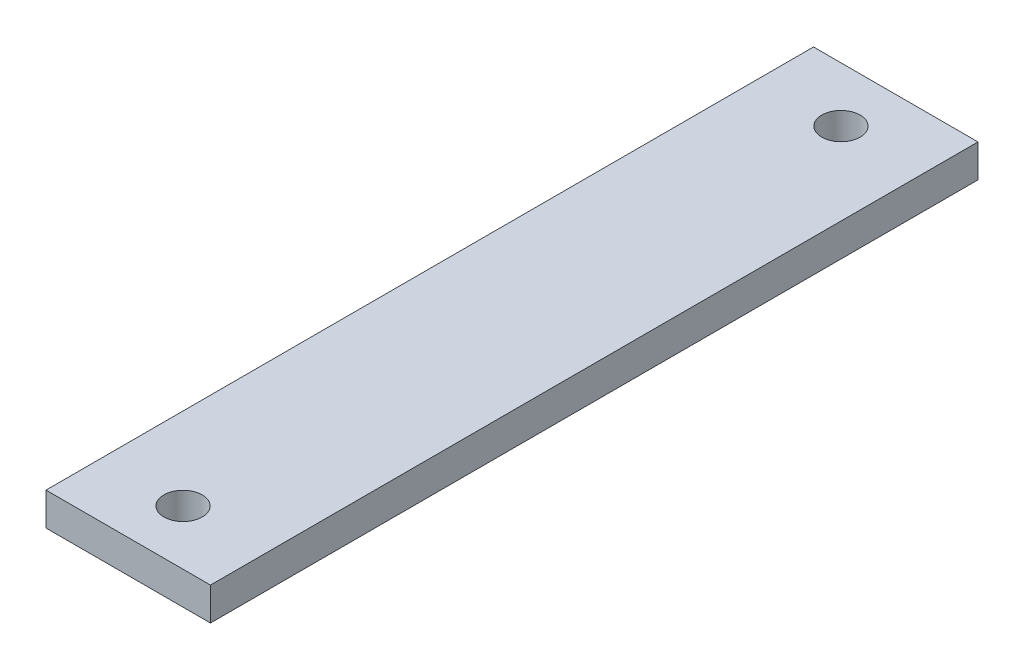
ISO-10303-21;
HEADER;
FILE_DESCRIPTION(('STEP AP214'),'2;1');
FILE_NAME('part.step','',(''),(''),'','','');
FILE_SCHEMA(('AUTOMOTIVE_DESIGN { 1 0 10303 214 1 1 1 1 }'));
ENDSEC;
DATA;
#1=APPLICATION_CONTEXT('core data for automotive mechanical design processes');
#2=APPLICATION_PROTOCOL_DEFINITION('international standard','automotive_design',2000,#1);
#3=PRODUCT_CONTEXT('',#1,'mechanical');
#4=PRODUCT('Part','Part','',(#3));
#5=PRODUCT_RELATED_PRODUCT_CATEGORY('part','',(#4));
#6=PRODUCT_DEFINITION_FORMATION('','',#4);
#7=PRODUCT_DEFINITION_CONTEXT('part definition',#1,'design');
#8=PRODUCT_DEFINITION('design','',#6,#7);
#9=PRODUCT_DEFINITION_SHAPE('','',#8);
#10=(LENGTH_UNIT() NAMED_UNIT(*) SI_UNIT(.MILLI.,.METRE.));
#11=(NAMED_UNIT(*) PLANE_ANGLE_UNIT() SI_UNIT($,.RADIAN.));
#12=(NAMED_UNIT(*) SI_UNIT($,.STERADIAN.) SOLID_ANGLE_UNIT());
#13=UNCERTAINTY_MEASURE_WITH_UNIT(LENGTH_MEASURE(1.E-05),#10,'distance_accuracy_value','');
#14=(GEOMETRIC_REPRESENTATION_CONTEXT(3) GLOBAL_UNCERTAINTY_ASSIGNED_CONTEXT((#13)) GLOBAL_UNIT_ASSIGNED_CONTEXT((#10,
#11,#12)) REPRESENTATION_CONTEXT('',''));
#15=CARTESIAN_POINT('',(0.,0.,0.));
#16=DIRECTION('',(0.,0.,1.));
#17=DIRECTION('',(1.,0.,0.));
#18=AXIS2_PLACEMENT_3D('',#15,#16,#17);
#19=CARTESIAN_POINT('',(0.,3.,0.));
#20=DIRECTION('',(0.,-1.,0.));
#21=DIRECTION('',(0.,0.,-1.));
#22=AXIS2_PLACEMENT_3D('',#19,#20,#21);
#23=PLANE('',#22);
#24=DIRECTION('',(0.,0.,1.));
#25=VECTOR('',#24,1.);
#26=CARTESIAN_POINT('',(0.,3.,0.));
#27=LINE('',#26,#25);
#28=CARTESIAN_POINT('',(0.,3.,-70.));
#29=VERTEX_POINT('',#28);
#30=CARTESIAN_POINT('',(0.,3.,0.));
#31=VERTEX_POINT('',#30);
#32=EDGE_CURVE('E92',#29,#31,#27,.T.);
#33=ORIENTED_EDGE('',*,*,#32,.T.);
#34=DIRECTION('',(1.,0.,0.));
#35=VECTOR('',#34,1.);
#36=CARTESIAN_POINT('',(0.,3.,0.));
#37=LINE('',#36,#35);
#38=CARTESIAN_POINT('',(15.,3.,0.));
#39=VERTEX_POINT('',#38);
#40=EDGE_CURVE('E87',#31,#39,#37,.T.);
#41=ORIENTED_EDGE('',*,*,#40,.T.);
#42=DIRECTION('',(0.,0.,-1.));
#43=VECTOR('',#42,1.);
#44=CARTESIAN_POINT('',(15.,3.,0.));
#45=LINE('',#44,#43);
#46=CARTESIAN_POINT('',(15.,3.,-70.));
#47=VERTEX_POINT('',#46);
#48=EDGE_CURVE('E90',#39,#47,#45,.T.);
#49=ORIENTED_EDGE('',*,*,#48,.T.);
#50=DIRECTION('',(-1.,0.,0.));
#51=VECTOR('',#50,1.);
#52=CARTESIAN_POINT('',(0.,3.,-70.));
#53=LINE('',#52,#51);
#54=EDGE_CURVE('E57',#47,#29,#53,.T.);
#55=ORIENTED_EDGE('',*,*,#54,.T.);
#56=EDGE_LOOP('',(#33,#41,#49,#55));
#57=FACE_BOUND('',#56,.T.);
#58=CARTESIAN_POINT('',(7.5,3.,-5.));
#59=DIRECTION('',(0.,1.,0.));
#60=DIRECTION('',(0.,0.,1.));
#61=AXIS2_PLACEMENT_3D('',#58,#59,#60);
#62=CIRCLE('',#61,1.75);
#63=CARTESIAN_POINT('',(7.5,3.,-3.25));
#64=VERTEX_POINT('',#63);
#65=EDGE_CURVE('E112',#64,#64,#62,.T.);
#66=ORIENTED_EDGE('',*,*,#65,.F.);
#67=EDGE_LOOP('',(#66));
#68=FACE_BOUND('',#67,.T.);
#69=CARTESIAN_POINT('',(7.5,3.,-65.));
#70=DIRECTION('',(0.,1.,0.));
#71=DIRECTION('',(0.,0.,-1.));
#72=AXIS2_PLACEMENT_3D('',#69,#70,#71);
#73=CIRCLE('',#72,1.75);
#74=CARTESIAN_POINT('',(7.5,3.,-66.75));
#75=VERTEX_POINT('',#74);
#76=EDGE_CURVE('E134',#75,#75,#73,.T.);
#77=ORIENTED_EDGE('',*,*,#76,.F.);
#78=EDGE_LOOP('',(#77));
#79=FACE_BOUND('',#78,.T.);
#80=ADVANCED_FACE('F39',(#57,#68,#79),#23,.F.);
#81=CARTESIAN_POINT('',(0.,0.,0.));
#82=DIRECTION('',(0.,-1.,0.));
#83=DIRECTION('',(0.,0.,-1.));
#84=AXIS2_PLACEMENT_3D('',#81,#82,#83);
#85=PLANE('',#84);
#86=CARTESIAN_POINT('',(7.5,0.,-5.));
#87=DIRECTION('',(0.,1.,0.));
#88=DIRECTION('',(0.,0.,1.));
#89=AXIS2_PLACEMENT_3D('',#86,#87,#88);
#90=CIRCLE('',#89,1.75);
#91=CARTESIAN_POINT('',(7.5,0.,-3.25));
#92=VERTEX_POINT('',#91);
#93=EDGE_CURVE('E130',#92,#92,#90,.T.);
#94=ORIENTED_EDGE('',*,*,#93,.T.);
#95=EDGE_LOOP('',(#94));
#96=FACE_BOUND('',#95,.T.);
#97=DIRECTION('',(0.,0.,1.));
#98=VECTOR('',#97,1.);
#99=CARTESIAN_POINT('',(0.,0.,0.));
#100=LINE('',#99,#98);
#101=CARTESIAN_POINT('',(0.,0.,-70.));
#102=VERTEX_POINT('',#101);
#103=CARTESIAN_POINT('',(0.,0.,0.));
#104=VERTEX_POINT('',#103);
#105=EDGE_CURVE('E108',#102,#104,#100,.T.);
#106=ORIENTED_EDGE('',*,*,#105,.F.);
#107=DIRECTION('',(-1.,0.,0.));
#108=VECTOR('',#107,1.);
#109=CARTESIAN_POINT('',(0.,0.,-70.));
#110=LINE('',#109,#108);
#111=CARTESIAN_POINT('',(15.,0.,-70.));
#112=VERTEX_POINT('',#111);
#113=EDGE_CURVE('E80',#112,#102,#110,.T.);
#114=ORIENTED_EDGE('',*,*,#113,.F.);
#115=DIRECTION('',(0.,0.,-1.));
#116=VECTOR('',#115,1.);
#117=CARTESIAN_POINT('',(15.,0.,0.));
#118=LINE('',#117,#116);
#119=CARTESIAN_POINT('',(15.,0.,0.));
#120=VERTEX_POINT('',#119);
#121=EDGE_CURVE('E74',#120,#112,#118,.T.);
#122=ORIENTED_EDGE('',*,*,#121,.F.);
#123=DIRECTION('',(1.,0.,0.));
#124=VECTOR('',#123,1.);
#125=CARTESIAN_POINT('',(0.,0.,0.));
#126=LINE('',#125,#124);
#127=EDGE_CURVE('E97',#104,#120,#126,.T.);
#128=ORIENTED_EDGE('',*,*,#127,.F.);
#129=EDGE_LOOP('',(#106,#114,#122,#128));
#130=FACE_BOUND('',#129,.T.);
#131=CARTESIAN_POINT('',(7.5,0.,-65.));
#132=DIRECTION('',(0.,1.,0.));
#133=DIRECTION('',(0.,0.,-1.));
#134=AXIS2_PLACEMENT_3D('',#131,#132,#133);
#135=CIRCLE('',#134,1.75);
#136=CARTESIAN_POINT('',(7.5,0.,-66.75));
#137=VERTEX_POINT('',#136);
#138=EDGE_CURVE('E138',#137,#137,#135,.T.);
#139=ORIENTED_EDGE('',*,*,#138,.T.);
#140=EDGE_LOOP('',(#139));
#141=FACE_BOUND('',#140,.T.);
#142=ADVANCED_FACE('F125',(#96,#130,#141),#85,.T.);
#143=CARTESIAN_POINT('',(0.,3.,0.));
#144=DIRECTION('',(1.,0.,0.));
#145=DIRECTION('',(0.,0.,-1.));
#146=AXIS2_PLACEMENT_3D('',#143,#144,#145);
#147=PLANE('',#146);
#148=ORIENTED_EDGE('',*,*,#105,.T.);
#149=DIRECTION('',(0.,-1.,0.));
#150=VECTOR('',#149,1.);
#151=CARTESIAN_POINT('',(0.,3.,0.));
#152=LINE('',#151,#150);
#153=EDGE_CURVE('E11',#31,#104,#152,.T.);
#154=ORIENTED_EDGE('',*,*,#153,.F.);
#155=ORIENTED_EDGE('',*,*,#32,.F.);
#156=DIRECTION('',(0.,-1.,0.));
#157=VECTOR('',#156,1.);
#158=CARTESIAN_POINT('',(0.,3.,-70.));
#159=LINE('',#158,#157);
#160=EDGE_CURVE('E104',#29,#102,#159,.T.);
#161=ORIENTED_EDGE('',*,*,#160,.T.);
#162=EDGE_LOOP('',(#148,#154,#155,#161));
#163=FACE_BOUND('',#162,.T.);
#164=ADVANCED_FACE('F41',(#163),#147,.F.);
#165=CARTESIAN_POINT('',(0.,3.,0.));
#166=DIRECTION('',(0.,0.,-1.));
#167=DIRECTION('',(-1.,0.,0.));
#168=AXIS2_PLACEMENT_3D('',#165,#166,#167);
#169=PLANE('',#168);
#170=ORIENTED_EDGE('',*,*,#127,.T.);
#171=DIRECTION('',(0.,-1.,0.));
#172=VECTOR('',#171,1.);
#173=CARTESIAN_POINT('',(15.,3.,0.));
#174=LINE('',#173,#172);
#175=EDGE_CURVE('E49',#39,#120,#174,.T.);
#176=ORIENTED_EDGE('',*,*,#175,.F.);
#177=ORIENTED_EDGE('',*,*,#40,.F.);
#178=ORIENTED_EDGE('',*,*,#153,.T.);
#179=EDGE_LOOP('',(#170,#176,#177,#178));
#180=FACE_BOUND('',#179,.T.);
#181=ADVANCED_FACE('F96',(#180),#169,.F.);
#182=CARTESIAN_POINT('',(15.,3.,0.));
#183=DIRECTION('',(-1.,0.,0.));
#184=DIRECTION('',(0.,0.,1.));
#185=AXIS2_PLACEMENT_3D('',#182,#183,#184);
#186=PLANE('',#185);
#187=ORIENTED_EDGE('',*,*,#121,.T.);
#188=DIRECTION('',(0.,-1.,0.));
#189=VECTOR('',#188,1.);
#190=CARTESIAN_POINT('',(15.,3.,-70.));
#191=LINE('',#190,#189);
#192=EDGE_CURVE('E99',#47,#112,#191,.T.);
#193=ORIENTED_EDGE('',*,*,#192,.F.);
#194=ORIENTED_EDGE('',*,*,#48,.F.);
#195=ORIENTED_EDGE('',*,*,#175,.T.);
#196=EDGE_LOOP('',(#187,#193,#194,#195));
#197=FACE_BOUND('',#196,.T.);
#198=ADVANCED_FACE('F100',(#197),#186,.F.);
#199=CARTESIAN_POINT('',(0.,3.,-70.));
#200=DIRECTION('',(0.,0.,1.));
#201=DIRECTION('',(1.,0.,0.));
#202=AXIS2_PLACEMENT_3D('',#199,#200,#201);
#203=PLANE('',#202);
#204=ORIENTED_EDGE('',*,*,#113,.T.);
#205=ORIENTED_EDGE('',*,*,#160,.F.);
#206=ORIENTED_EDGE('',*,*,#54,.F.);
#207=ORIENTED_EDGE('',*,*,#192,.T.);
#208=EDGE_LOOP('',(#204,#205,#206,#207));
#209=FACE_BOUND('',#208,.T.);
#210=ADVANCED_FACE('F122',(#209),#203,.F.);
#211=CARTESIAN_POINT('',(7.5,3.,-5.));
#212=DIRECTION('',(0.,-1.,0.));
#213=DIRECTION('',(0.,0.,-1.));
#214=AXIS2_PLACEMENT_3D('',#211,#212,#213);
#215=CYLINDRICAL_SURFACE('',#214,1.75);
#216=ORIENTED_EDGE('',*,*,#65,.T.);
#217=EDGE_LOOP('',(#216));
#218=FACE_BOUND('',#217,.T.);
#219=ORIENTED_EDGE('',*,*,#93,.F.);
#220=EDGE_LOOP('',(#219));
#221=FACE_BOUND('',#220,.T.);
#222=ADVANCED_FACE('F157',(#218,#221),#215,.F.);
#223=CARTESIAN_POINT('',(7.5,3.,-65.));
#224=DIRECTION('',(0.,-1.,0.));
#225=DIRECTION('',(0.,0.,-1.));
#226=AXIS2_PLACEMENT_3D('',#223,#224,#225);
#227=CYLINDRICAL_SURFACE('',#226,1.75);
#228=ORIENTED_EDGE('',*,*,#76,.T.);
#229=EDGE_LOOP('',(#228));
#230=FACE_BOUND('',#229,.T.);
#231=ORIENTED_EDGE('',*,*,#138,.F.);
#232=EDGE_LOOP('',(#231));
#233=FACE_BOUND('',#232,.T.);
#234=ADVANCED_FACE('F146',(#230,#233),#227,.F.);
#235=CLOSED_SHELL('',(#80,#142,#164,#181,#198,#210,#222,#234));
#236=MANIFOLD_SOLID_BREP('B2',#235);
#237=ADVANCED_BREP_SHAPE_REPRESENTATION('',(#18,#236),#14);
#238=SHAPE_DEFINITION_REPRESENTATION(#9,#237);
ENDSEC;
END-ISO-10303-21;
